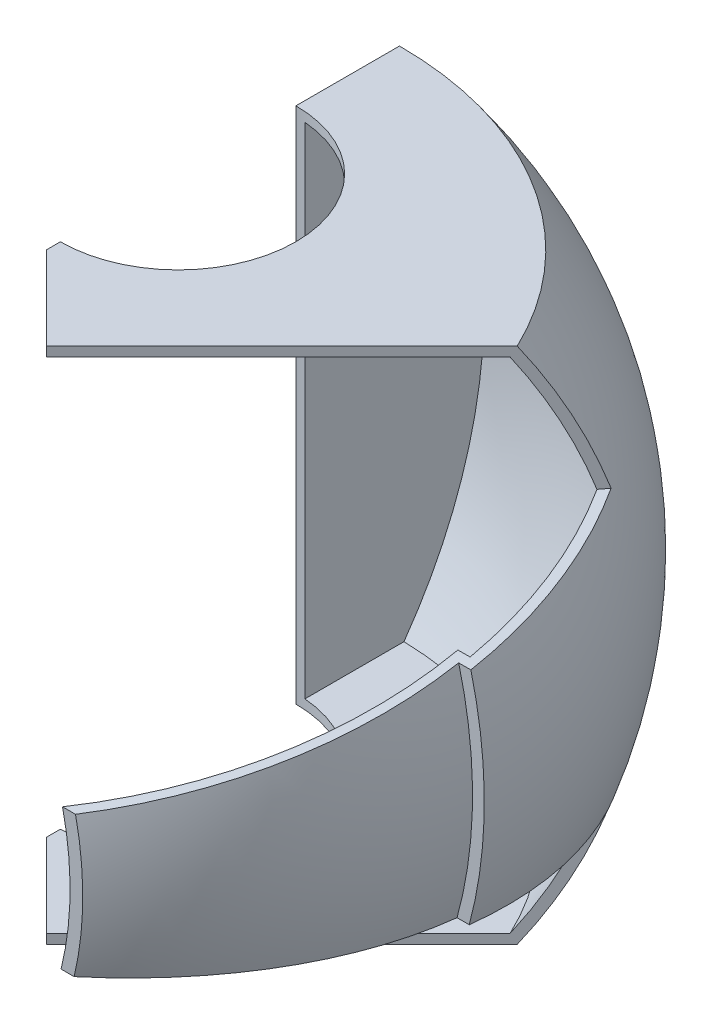
ISO-10303-21;
HEADER;
FILE_DESCRIPTION(('STEP AP214'),'2;1');
FILE_NAME('part.step','',(''),(''),'','','');
FILE_SCHEMA(('AUTOMOTIVE_DESIGN { 1 0 10303 214 1 1 1 1 }'));
ENDSEC;
DATA;
#1=APPLICATION_CONTEXT('core data for automotive mechanical design processes');
#2=APPLICATION_PROTOCOL_DEFINITION('international standard','automotive_design',2000,#1);
#3=PRODUCT_CONTEXT('',#1,'mechanical');
#4=PRODUCT('Part','Part','',(#3));
#5=PRODUCT_RELATED_PRODUCT_CATEGORY('part','',(#4));
#6=PRODUCT_DEFINITION_FORMATION('','',#4);
#7=PRODUCT_DEFINITION_CONTEXT('part definition',#1,'design');
#8=PRODUCT_DEFINITION('design','',#6,#7);
#9=PRODUCT_DEFINITION_SHAPE('','',#8);
#10=(LENGTH_UNIT() NAMED_UNIT(*) SI_UNIT(.MILLI.,.METRE.));
#11=(NAMED_UNIT(*) PLANE_ANGLE_UNIT() SI_UNIT($,.RADIAN.));
#12=(NAMED_UNIT(*) SI_UNIT($,.STERADIAN.) SOLID_ANGLE_UNIT());
#13=UNCERTAINTY_MEASURE_WITH_UNIT(LENGTH_MEASURE(1.E-05),#10,'distance_accuracy_value','');
#14=(GEOMETRIC_REPRESENTATION_CONTEXT(3) GLOBAL_UNCERTAINTY_ASSIGNED_CONTEXT((#13)) GLOBAL_UNIT_ASSIGNED_CONTEXT((#10,
#11,#12)) REPRESENTATION_CONTEXT('',''));
#15=CARTESIAN_POINT('',(0.,0.,0.));
#16=DIRECTION('',(0.,0.,1.));
#17=DIRECTION('',(1.,0.,0.));
#18=AXIS2_PLACEMENT_3D('',#15,#16,#17);
#19=CARTESIAN_POINT('',(0.,0.,0.));
#20=DIRECTION('',(-1.,0.,0.));
#21=DIRECTION('',(0.,0.,1.));
#22=AXIS2_PLACEMENT_3D('',#19,#20,#21);
#23=PLANE('',#22);
#24=DIRECTION('',(0.,-1.,0.));
#25=VECTOR('',#24,1.);
#26=CARTESIAN_POINT('',(0.,55.,0.));
#27=LINE('',#26,#25);
#28=CARTESIAN_POINT('',(0.,-53.,0.));
#29=VERTEX_POINT('',#28);
#30=CARTESIAN_POINT('',(0.,-55.,0.));
#31=VERTEX_POINT('',#30);
#32=EDGE_CURVE('E309',#29,#31,#27,.T.);
#33=ORIENTED_EDGE('',*,*,#32,.F.);
#34=DIRECTION('',(0.,0.,-1.));
#35=VECTOR('',#34,1.);
#36=CARTESIAN_POINT('',(0.,-53.,0.));
#37=LINE('',#36,#35);
#38=CARTESIAN_POINT('',(0.,-53.,-3.));
#39=VERTEX_POINT('',#38);
#40=EDGE_CURVE('E205',#29,#39,#37,.T.);
#41=ORIENTED_EDGE('',*,*,#40,.T.);
#42=DIRECTION('',(0.,-1.,0.));
#43=VECTOR('',#42,1.);
#44=CARTESIAN_POINT('',(0.,55.,-3.));
#45=LINE('',#44,#43);
#46=CARTESIAN_POINT('',(0.,-55.,-3.));
#47=VERTEX_POINT('',#46);
#48=EDGE_CURVE('E246',#47,#39,#45,.F.);
#49=ORIENTED_EDGE('',*,*,#48,.F.);
#50=DIRECTION('',(0.,0.,-1.));
#51=VECTOR('',#50,1.);
#52=CARTESIAN_POINT('',(0.,-55.,0.));
#53=LINE('',#52,#51);
#54=EDGE_CURVE('E317',#31,#47,#53,.T.);
#55=ORIENTED_EDGE('',*,*,#54,.F.);
#56=EDGE_LOOP('',(#33,#41,#49,#55));
#57=FACE_BOUND('',#56,.T.);
#58=ADVANCED_FACE('F33',(#57),#23,.T.);
#59=CARTESIAN_POINT('',(17.6776695296637,55.,17.6776695296636));
#60=DIRECTION('',(-0.70710678118655,0.,-0.707106781186545));
#61=DIRECTION('',(-0.707106781186545,0.,0.70710678118655));
#62=AXIS2_PLACEMENT_3D('',#59,#60,#61);
#63=PLANE('',#62);
#64=CARTESIAN_POINT('',(17.6776695296637,0.,17.6776695296636));
#65=DIRECTION('',(-0.70710678118655,0.,-0.707106781186545));
#66=DIRECTION('',(-0.707106781186545,0.,0.70710678118655));
#67=AXIS2_PLACEMENT_3D('',#64,#65,#66);
#68=CIRCLE('',#67,87.4985714169094);
#69=CARTESIAN_POINT('',(76.1371344084863,28.6527822761313,-40.7817953491593));
#70=VERTEX_POINT('',#69);
#71=CARTESIAN_POINT('',(66.906725990254,53.,-31.551386930927));
#72=VERTEX_POINT('',#71);
#73=EDGE_CURVE('E191',#70,#72,#68,.F.);
#74=ORIENTED_EDGE('',*,*,#73,.F.);
#75=DIRECTION('',(0.703571165799067,0.0998760697678762,-0.703571165799071));
#76=VECTOR('',#75,1.);
#77=CARTESIAN_POINT('',(20.112233053861,20.6997176418269,15.2431060054663));
#78=LINE('',#77,#76);
#79=CARTESIAN_POINT('',(77.6391324007676,28.8659997352322,-42.2837933414406));
#80=VERTEX_POINT('',#79);
#81=EDGE_CURVE('E290',#70,#80,#78,.T.);
#82=ORIENTED_EDGE('',*,*,#81,.T.);
#83=CARTESIAN_POINT('',(17.6776695296637,0.,17.6776695296636));
#84=DIRECTION('',(-0.70710678118655,0.,-0.707106781186545));
#85=DIRECTION('',(-0.707106781186545,0.,0.70710678118655));
#86=AXIS2_PLACEMENT_3D('',#83,#84,#85);
#87=CIRCLE('',#86,89.5767827062348);
#88=CARTESIAN_POINT('',(67.6726692796386,55.,-32.3173302203115));
#89=VERTEX_POINT('',#88);
#90=EDGE_CURVE('E275',#80,#89,#87,.F.);
#91=ORIENTED_EDGE('',*,*,#90,.T.);
#92=DIRECTION('',(0.707106781186545,0.,-0.70710678118655));
#93=VECTOR('',#92,1.);
#94=CARTESIAN_POINT('',(17.6776695296637,55.,17.6776695296636));
#95=LINE('',#94,#93);
#96=CARTESIAN_POINT('',(17.6776695296637,55.,17.6776695296637));
#97=VERTEX_POINT('',#96);
#98=EDGE_CURVE('E296',#97,#89,#95,.T.);
#99=ORIENTED_EDGE('',*,*,#98,.F.);
#100=DIRECTION('',(0.,-1.,0.));
#101=VECTOR('',#100,1.);
#102=CARTESIAN_POINT('',(17.6776695296637,55.,17.6776695296637));
#103=LINE('',#102,#101);
#104=CARTESIAN_POINT('',(17.6776695296637,53.,17.6776695296637));
#105=VERTEX_POINT('',#104);
#106=EDGE_CURVE('E310',#97,#105,#103,.T.);
#107=ORIENTED_EDGE('',*,*,#106,.T.);
#108=DIRECTION('',(0.707106781186545,0.,-0.70710678118655));
#109=VECTOR('',#108,1.);
#110=CARTESIAN_POINT('',(17.6776695296637,53.,17.6776695296636));
#111=LINE('',#110,#109);
#112=EDGE_CURVE('E177',#105,#72,#111,.T.);
#113=ORIENTED_EDGE('',*,*,#112,.T.);
#114=EDGE_LOOP('',(#74,#82,#91,#99,#107,#113));
#115=FACE_BOUND('',#114,.T.);
#116=ADVANCED_FACE('F352',(#115),#63,.F.);
#117=CARTESIAN_POINT('',(0.,55.,0.));
#118=DIRECTION('',(0.707106781186546,0.,-0.707106781186549));
#119=DIRECTION('',(-0.707106781186549,0.,-0.707106781186546));
#120=AXIS2_PLACEMENT_3D('',#117,#118,#119);
#121=PLANE('',#120);
#122=DIRECTION('',(0.707106781186549,0.,0.707106781186546));
#123=VECTOR('',#122,1.);
#124=CARTESIAN_POINT('',(0.,-53.,0.));
#125=LINE('',#124,#123);
#126=CARTESIAN_POINT('',(17.6776695296637,-53.,17.6776695296637));
#127=VERTEX_POINT('',#126);
#128=EDGE_CURVE('E186',#29,#127,#125,.T.);
#129=ORIENTED_EDGE('',*,*,#128,.F.);
#130=ORIENTED_EDGE('',*,*,#32,.T.);
#131=DIRECTION('',(0.707106781186549,0.,0.707106781186546));
#132=VECTOR('',#131,1.);
#133=CARTESIAN_POINT('',(0.,-55.,0.));
#134=LINE('',#133,#132);
#135=CARTESIAN_POINT('',(17.6776695296637,-55.,17.6776695296637));
#136=VERTEX_POINT('',#135);
#137=EDGE_CURVE('E292',#31,#136,#134,.T.);
#138=ORIENTED_EDGE('',*,*,#137,.T.);
#139=EDGE_CURVE('E300',#127,#136,#103,.T.);
#140=ORIENTED_EDGE('',*,*,#139,.F.);
#141=EDGE_LOOP('',(#129,#130,#138,#140));
#142=FACE_BOUND('',#141,.T.);
#143=ADVANCED_FACE('F378',(#142),#121,.F.);
#144=CARTESIAN_POINT('',(0.,55.,-28.));
#145=DIRECTION('',(0.,-1.,0.));
#146=DIRECTION('',(0.,0.,-1.));
#147=AXIS2_PLACEMENT_3D('',#144,#145,#146);
#148=CYLINDRICAL_SURFACE('',#147,25.);
#149=CARTESIAN_POINT('',(0.,-53.,-28.));
#150=DIRECTION('',(0.,-1.,0.));
#151=DIRECTION('',(0.,0.,-1.));
#152=AXIS2_PLACEMENT_3D('',#149,#150,#151);
#153=CIRCLE('',#152,25.);
#154=CARTESIAN_POINT('',(1.99999999999963,-53.,-52.9198715887543));
#155=VERTEX_POINT('',#154);
#156=EDGE_CURVE('E212',#155,#39,#153,.T.);
#157=ORIENTED_EDGE('',*,*,#156,.F.);
#158=DIRECTION('',(0.,-1.,0.));
#159=VECTOR('',#158,1.);
#160=CARTESIAN_POINT('',(1.99999999999963,53.,-52.9198715887543));
#161=LINE('',#160,#159);
#162=CARTESIAN_POINT('',(1.99999999999963,53.,-52.9198715887543));
#163=VERTEX_POINT('',#162);
#164=EDGE_CURVE('E210',#163,#155,#161,.T.);
#165=ORIENTED_EDGE('',*,*,#164,.F.);
#166=CARTESIAN_POINT('',(0.,53.,-28.));
#167=DIRECTION('',(0.,-1.,0.));
#168=DIRECTION('',(0.,0.,-1.));
#169=AXIS2_PLACEMENT_3D('',#166,#167,#168);
#170=CIRCLE('',#169,25.);
#171=CARTESIAN_POINT('',(0.,53.,-3.));
#172=VERTEX_POINT('',#171);
#173=EDGE_CURVE('E174',#163,#172,#170,.T.);
#174=ORIENTED_EDGE('',*,*,#173,.T.);
#175=CARTESIAN_POINT('',(0.,55.,-3.));
#176=VERTEX_POINT('',#175);
#177=EDGE_CURVE('E244',#172,#176,#45,.F.);
#178=ORIENTED_EDGE('',*,*,#177,.T.);
#179=CARTESIAN_POINT('',(0.,55.,-28.));
#180=DIRECTION('',(0.,-1.,0.));
#181=DIRECTION('',(0.,0.,-1.));
#182=AXIS2_PLACEMENT_3D('',#179,#180,#181);
#183=CIRCLE('',#182,25.);
#184=CARTESIAN_POINT('',(-3.70097021917372E-13,55.,-53.));
#185=VERTEX_POINT('',#184);
#186=EDGE_CURVE('E241',#185,#176,#183,.T.);
#187=ORIENTED_EDGE('',*,*,#186,.F.);
#188=DIRECTION('',(0.,-1.,0.));
#189=VECTOR('',#188,1.);
#190=CARTESIAN_POINT('',(-3.70097021917372E-13,55.,-53.));
#191=LINE('',#190,#189);
#192=CARTESIAN_POINT('',(-3.70097021917372E-13,-55.,-53.));
#193=VERTEX_POINT('',#192);
#194=EDGE_CURVE('E56',#185,#193,#191,.T.);
#195=ORIENTED_EDGE('',*,*,#194,.T.);
#196=CARTESIAN_POINT('',(0.,-55.,-28.));
#197=DIRECTION('',(0.,-1.,0.));
#198=DIRECTION('',(0.,0.,-1.));
#199=AXIS2_PLACEMENT_3D('',#196,#197,#198);
#200=CIRCLE('',#199,25.);
#201=EDGE_CURVE('E229',#193,#47,#200,.T.);
#202=ORIENTED_EDGE('',*,*,#201,.T.);
#203=ORIENTED_EDGE('',*,*,#48,.T.);
#204=EDGE_LOOP('',(#157,#165,#174,#178,#187,#195,#202,#203));
#205=FACE_BOUND('',#204,.T.);
#206=ADVANCED_FACE('F384',(#205),#148,.F.);
#207=ORIENTED_EDGE('',*,*,#194,.F.);
#208=DIRECTION('',(0.,0.,-1.));
#209=VECTOR('',#208,1.);
#210=CARTESIAN_POINT('',(0.,55.,0.));
#211=LINE('',#210,#209);
#212=CARTESIAN_POINT('',(-5.23675645672742E-13,55.,-74.9933330370107));
#213=VERTEX_POINT('',#212);
#214=EDGE_CURVE('E308',#185,#213,#211,.T.);
#215=ORIENTED_EDGE('',*,*,#214,.T.);
#216=CARTESIAN_POINT('',(0.,0.,0.));
#217=DIRECTION('',(-1.,0.,0.));
#218=DIRECTION('',(0.,0.,1.));
#219=AXIS2_PLACEMENT_3D('',#216,#217,#218);
#220=CIRCLE('',#219,93.);
#221=CARTESIAN_POINT('',(-5.23675645672742E-13,-55.,-74.9933330370107));
#222=VERTEX_POINT('',#221);
#223=EDGE_CURVE('E281',#222,#213,#220,.F.);
#224=ORIENTED_EDGE('',*,*,#223,.F.);
#225=EDGE_CURVE('E316',#193,#222,#53,.T.);
#226=ORIENTED_EDGE('',*,*,#225,.F.);
#227=EDGE_LOOP('',(#207,#215,#224,#226));
#228=FACE_BOUND('',#227,.T.);
#229=ADVANCED_FACE('F344',(#228),#23,.T.);
#230=CARTESIAN_POINT('',(-121.51311132399,-15.653786999192,60.));
#231=DIRECTION('',(0.,0.,-1.));
#232=DIRECTION('',(-1.,0.,0.));
#233=AXIS2_PLACEMENT_3D('',#230,#231,#232);
#234=PLANE('',#233);
#235=CARTESIAN_POINT('',(0.,0.,60.));
#236=DIRECTION('',(0.,0.,-1.));
#237=DIRECTION('',(-1.,0.,0.));
#238=AXIS2_PLACEMENT_3D('',#235,#236,#237);
#239=CIRCLE('',#238,65.0557453266043);
#240=CARTESIAN_POINT('',(63.1443501240128,-15.653786999192,60.));
#241=VERTEX_POINT('',#240);
#242=CARTESIAN_POINT('',(63.4542053179728,14.346213000808,60.));
#243=VERTEX_POINT('',#242);
#244=EDGE_CURVE('E204',#241,#243,#239,.F.);
#245=ORIENTED_EDGE('',*,*,#244,.F.);
#246=DIRECTION('',(1.,0.,0.));
#247=VECTOR('',#246,1.);
#248=CARTESIAN_POINT('',(-121.51311132399,-15.653786999192,60.));
#249=LINE('',#248,#247);
#250=CARTESIAN_POINT('',(65.9181989482717,-15.653786999192,60.));
#251=VERTEX_POINT('',#250);
#252=EDGE_CURVE('E285',#241,#251,#249,.T.);
#253=ORIENTED_EDGE('',*,*,#252,.T.);
#254=CARTESIAN_POINT('',(0.,0.,60.));
#255=DIRECTION('',(0.,0.,-1.));
#256=DIRECTION('',(-1.,0.,0.));
#257=AXIS2_PLACEMENT_3D('',#254,#255,#256);
#258=CIRCLE('',#257,67.7513837497066);
#259=CARTESIAN_POINT('',(66.2150751153803,14.346213000808,60.));
#260=VERTEX_POINT('',#259);
#261=EDGE_CURVE('E11',#251,#260,#258,.F.);
#262=ORIENTED_EDGE('',*,*,#261,.T.);
#263=DIRECTION('',(1.,0.,0.));
#264=VECTOR('',#263,1.);
#265=CARTESIAN_POINT('',(-121.51311132399,14.346213000808,60.));
#266=LINE('',#265,#264);
#267=EDGE_CURVE('E284',#243,#260,#266,.T.);
#268=ORIENTED_EDGE('',*,*,#267,.F.);
#269=EDGE_LOOP('',(#245,#253,#262,#268));
#270=FACE_BOUND('',#269,.T.);
#271=ADVANCED_FACE('F365',(#270),#234,.F.);
#272=DIRECTION('',(0.707106781186545,0.,-0.70710678118655));
#273=VECTOR('',#272,1.);
#274=CARTESIAN_POINT('',(17.6776695296637,-53.,17.6776695296636));
#275=LINE('',#274,#273);
#276=CARTESIAN_POINT('',(66.906725990254,-53.,-31.551386930927));
#277=VERTEX_POINT('',#276);
#278=EDGE_CURVE('E217',#127,#277,#275,.T.);
#279=ORIENTED_EDGE('',*,*,#278,.F.);
#280=ORIENTED_EDGE('',*,*,#139,.T.);
#281=DIRECTION('',(0.707106781186545,0.,-0.70710678118655));
#282=VECTOR('',#281,1.);
#283=CARTESIAN_POINT('',(17.6776695296637,-55.,17.6776695296636));
#284=LINE('',#283,#282);
#285=CARTESIAN_POINT('',(67.6726692796386,-55.,-32.3173302203115));
#286=VERTEX_POINT('',#285);
#287=EDGE_CURVE('E297',#136,#286,#284,.T.);
#288=ORIENTED_EDGE('',*,*,#287,.T.);
#289=CARTESIAN_POINT('',(17.6776695296637,0.,17.6776695296636));
#290=DIRECTION('',(-0.70710678118655,0.,-0.707106781186545));
#291=DIRECTION('',(-0.707106781186545,0.,0.70710678118655));
#292=AXIS2_PLACEMENT_3D('',#289,#290,#291);
#293=CIRCLE('',#292,89.5767827062348);
#294=CARTESIAN_POINT('',(77.3275751809574,-30.1293463517463,-41.9722361216304));
#295=VERTEX_POINT('',#294);
#296=EDGE_CURVE('E278',#286,#295,#293,.F.);
#297=ORIENTED_EDGE('',*,*,#296,.T.);
#298=DIRECTION('',(0.703571165799067,-0.0998760697678761,-0.703571165799071));
#299=VECTOR('',#298,1.);
#300=CARTESIAN_POINT('',(12.2906584172629,-20.8969730653837,23.0646806420645));
#301=LINE('',#300,#299);
#302=CARTESIAN_POINT('',(75.8200473590021,-29.9153439007624,-40.4647082996751));
#303=VERTEX_POINT('',#302);
#304=EDGE_CURVE('E287',#303,#295,#301,.T.);
#305=ORIENTED_EDGE('',*,*,#304,.F.);
#306=CARTESIAN_POINT('',(17.6776695296637,0.,17.6776695296636));
#307=DIRECTION('',(-0.70710678118655,0.,-0.707106781186545));
#308=DIRECTION('',(-0.707106781186545,0.,0.70710678118655));
#309=AXIS2_PLACEMENT_3D('',#306,#307,#308);
#310=CIRCLE('',#309,87.4985714169094);
#311=EDGE_CURVE('E187',#277,#303,#310,.F.);
#312=ORIENTED_EDGE('',*,*,#311,.F.);
#313=EDGE_LOOP('',(#279,#280,#288,#297,#305,#312));
#314=FACE_BOUND('',#313,.T.);
#315=ADVANCED_FACE('F336',(#314),#63,.F.);
#316=DIRECTION('',(0.,0.,-1.));
#317=VECTOR('',#316,1.);
#318=CARTESIAN_POINT('',(0.,53.,0.));
#319=LINE('',#318,#317);
#320=CARTESIAN_POINT('',(0.,53.,0.));
#321=VERTEX_POINT('',#320);
#322=EDGE_CURVE('E48',#321,#172,#319,.T.);
#323=ORIENTED_EDGE('',*,*,#322,.F.);
#324=CARTESIAN_POINT('',(0.,55.,0.));
#325=VERTEX_POINT('',#324);
#326=EDGE_CURVE('E305',#325,#321,#27,.T.);
#327=ORIENTED_EDGE('',*,*,#326,.F.);
#328=EDGE_CURVE('E313',#325,#176,#211,.T.);
#329=ORIENTED_EDGE('',*,*,#328,.T.);
#330=ORIENTED_EDGE('',*,*,#177,.F.);
#331=EDGE_LOOP('',(#323,#327,#329,#330));
#332=FACE_BOUND('',#331,.T.);
#333=ADVANCED_FACE('F387',(#332),#23,.T.);
#334=CARTESIAN_POINT('',(0.,55.,0.));
#335=DIRECTION('',(0.,-1.,0.));
#336=DIRECTION('',(0.,0.,-1.));
#337=AXIS2_PLACEMENT_3D('',#334,#335,#336);
#338=PLANE('',#337);
#339=ORIENTED_EDGE('',*,*,#214,.F.);
#340=ORIENTED_EDGE('',*,*,#186,.T.);
#341=ORIENTED_EDGE('',*,*,#328,.F.);
#342=DIRECTION('',(0.707106781186549,0.,0.707106781186546));
#343=VECTOR('',#342,1.);
#344=CARTESIAN_POINT('',(0.,55.,0.));
#345=LINE('',#344,#343);
#346=EDGE_CURVE('E293',#325,#97,#345,.T.);
#347=ORIENTED_EDGE('',*,*,#346,.T.);
#348=ORIENTED_EDGE('',*,*,#98,.T.);
#349=CARTESIAN_POINT('',(0.,55.,0.));
#350=DIRECTION('',(0.,-1.,0.));
#351=DIRECTION('',(0.,0.,-1.));
#352=AXIS2_PLACEMENT_3D('',#349,#350,#351);
#353=CIRCLE('',#352,74.9933330370107);
#354=EDGE_CURVE('E264',#213,#89,#353,.T.);
#355=ORIENTED_EDGE('',*,*,#354,.F.);
#356=EDGE_LOOP('',(#339,#340,#341,#347,#348,#355));
#357=FACE_BOUND('',#356,.T.);
#358=ADVANCED_FACE('F348',(#357),#338,.F.);
#359=CARTESIAN_POINT('',(0.,-55.,0.));
#360=DIRECTION('',(0.,-1.,0.));
#361=DIRECTION('',(0.,0.,-1.));
#362=AXIS2_PLACEMENT_3D('',#359,#360,#361);
#363=PLANE('',#362);
#364=ORIENTED_EDGE('',*,*,#201,.F.);
#365=ORIENTED_EDGE('',*,*,#225,.T.);
#366=CARTESIAN_POINT('',(0.,-55.,0.));
#367=DIRECTION('',(0.,-1.,0.));
#368=DIRECTION('',(0.,0.,-1.));
#369=AXIS2_PLACEMENT_3D('',#366,#367,#368);
#370=CIRCLE('',#369,74.9933330370107);
#371=EDGE_CURVE('E266',#222,#286,#370,.T.);
#372=ORIENTED_EDGE('',*,*,#371,.T.);
#373=ORIENTED_EDGE('',*,*,#287,.F.);
#374=ORIENTED_EDGE('',*,*,#137,.F.);
#375=ORIENTED_EDGE('',*,*,#54,.T.);
#376=EDGE_LOOP('',(#364,#365,#372,#373,#374,#375));
#377=FACE_BOUND('',#376,.T.);
#378=ADVANCED_FACE('F35',(#377),#363,.T.);
#379=CARTESIAN_POINT('',(-121.51311132399,29.3462130008089,-45.6666277669362));
#380=DIRECTION('',(0.,0.990074030670294,0.140546838428607));
#381=DIRECTION('',(0.,-0.140546838428607,0.990074030670295));
#382=AXIS2_PLACEMENT_3D('',#379,#380,#381);
#383=PLANE('',#382);
#384=DIRECTION('',(-1.,0.,0.));
#385=VECTOR('',#384,1.);
#386=CARTESIAN_POINT('',(-121.51311132399,23.1474780705262,-1.99999999999958));
#387=LINE('',#386,#385);
#388=CARTESIAN_POINT('',(87.9840568453996,23.1474780705263,-2.00000000000031));
#389=VERTEX_POINT('',#388);
#390=CARTESIAN_POINT('',(85.3958093759554,23.1474780705263,-2.0000000000003));
#391=VERTEX_POINT('',#390);
#392=EDGE_CURVE('E227',#389,#391,#387,.T.);
#393=ORIENTED_EDGE('',*,*,#392,.T.);
#394=CARTESIAN_POINT('',(0.,22.4119328083095,3.18150582855883));
#395=DIRECTION('',(0.,0.990074030670294,0.140546838428607));
#396=DIRECTION('',(0.,-0.140546838428607,0.990074030670295));
#397=AXIS2_PLACEMENT_3D('',#394,#395,#396);
#398=CIRCLE('',#397,85.5560242674861);
#399=EDGE_CURVE('E194',#391,#243,#398,.F.);
#400=ORIENTED_EDGE('',*,*,#399,.T.);
#401=ORIENTED_EDGE('',*,*,#267,.T.);
#402=CARTESIAN_POINT('',(0.,22.4119328083095,3.18150582855883));
#403=DIRECTION('',(0.,0.990074030670294,0.140546838428607));
#404=DIRECTION('',(0.,-0.140546838428607,0.990074030670295));
#405=AXIS2_PLACEMENT_3D('',#402,#403,#404);
#406=CIRCLE('',#405,87.6232462789337);
#407=CARTESIAN_POINT('',(87.5643040074895,22.8635662940838,-3.05729133390936E-13));
#408=VERTEX_POINT('',#407);
#409=EDGE_CURVE('E261',#408,#260,#406,.F.);
#410=ORIENTED_EDGE('',*,*,#409,.F.);
#411=DIRECTION('',(-1.,0.,0.));
#412=VECTOR('',#411,1.);
#413=CARTESIAN_POINT('',(-121.51311132399,22.8635662940836,4.23272528138341E-13));
#414=LINE('',#413,#412);
#415=CARTESIAN_POINT('',(90.1457560638106,22.8635662940838,-3.14797267981245E-13));
#416=VERTEX_POINT('',#415);
#417=EDGE_CURVE('E256',#416,#408,#414,.T.);
#418=ORIENTED_EDGE('',*,*,#417,.F.);
#419=CARTESIAN_POINT('',(0.,22.4119328083095,3.18150582855883));
#420=DIRECTION('',(0.,0.990074030670294,0.140546838428607));
#421=DIRECTION('',(0.,-0.140546838428607,0.990074030670295));
#422=AXIS2_PLACEMENT_3D('',#419,#420,#421);
#423=CIRCLE('',#422,90.2030115265486);
#424=EDGE_CURVE('E272',#80,#416,#423,.F.);
#425=ORIENTED_EDGE('',*,*,#424,.F.);
#426=ORIENTED_EDGE('',*,*,#81,.F.);
#427=CARTESIAN_POINT('',(0.,22.4119328083095,3.18150582855883));
#428=DIRECTION('',(0.,0.990074030670294,0.140546838428607));
#429=DIRECTION('',(0.,-0.140546838428607,0.990074030670295));
#430=AXIS2_PLACEMENT_3D('',#427,#428,#429);
#431=CIRCLE('',#430,88.1395670993378);
#432=EDGE_CURVE('E224',#70,#389,#431,.F.);
#433=ORIENTED_EDGE('',*,*,#432,.T.);
#434=EDGE_LOOP('',(#393,#400,#401,#410,#418,#425,#426,#433));
#435=FACE_BOUND('',#434,.T.);
#436=ADVANCED_FACE('F355',(#435),#383,.T.);
#437=CARTESIAN_POINT('',(-121.51311132399,-30.653786999193,-45.6666277669362));
#438=DIRECTION('',(0.,0.990074030670294,-0.140546838428607));
#439=DIRECTION('',(0.,0.140546838428607,0.990074030670295));
#440=AXIS2_PLACEMENT_3D('',#437,#438,#439);
#441=PLANE('',#440);
#442=CARTESIAN_POINT('',(0.,-23.6936777564395,3.36345707114373));
#443=DIRECTION('',(0.,0.990074030670294,-0.140546838428607));
#444=DIRECTION('',(0.,0.140546838428607,0.990074030670295));
#445=AXIS2_PLACEMENT_3D('',#442,#443,#444);
#446=CIRCLE('',#445,85.2029740731189);
#447=CARTESIAN_POINT('',(85.0305852520544,-24.4550520689103,-2.0000000000003));
#448=VERTEX_POINT('',#447);
#449=EDGE_CURVE('E199',#448,#241,#446,.F.);
#450=ORIENTED_EDGE('',*,*,#449,.F.);
#451=DIRECTION('',(-1.,0.,0.));
#452=VECTOR('',#451,1.);
#453=CARTESIAN_POINT('',(-121.51311132399,-24.4550520689102,-1.99999999999958));
#454=LINE('',#453,#452);
#455=CARTESIAN_POINT('',(87.6296207244268,-24.4550520689103,-2.00000000000031));
#456=VERTEX_POINT('',#455);
#457=EDGE_CURVE('E209',#456,#448,#454,.T.);
#458=ORIENTED_EDGE('',*,*,#457,.F.);
#459=CARTESIAN_POINT('',(0.,-23.6936777564395,3.36345707114373));
#460=DIRECTION('',(0.,0.990074030670294,-0.140546838428607));
#461=DIRECTION('',(0.,0.140546838428607,0.990074030670295));
#462=AXIS2_PLACEMENT_3D('',#459,#460,#461);
#463=CIRCLE('',#462,87.7969064996289);
#464=EDGE_CURVE('E196',#303,#456,#463,.F.);
#465=ORIENTED_EDGE('',*,*,#464,.F.);
#466=ORIENTED_EDGE('',*,*,#304,.T.);
#467=CARTESIAN_POINT('',(0.,-23.6936777564395,3.36345707114373));
#468=DIRECTION('',(0.,0.990074030670294,-0.140546838428607));
#469=DIRECTION('',(0.,0.140546838428607,0.990074030670295));
#470=AXIS2_PLACEMENT_3D('',#467,#468,#469);
#471=CIRCLE('',#470,89.8682190259971);
#472=CARTESIAN_POINT('',(89.8039864202132,-24.1711402924678,-3.13550105511352E-13));
#473=VERTEX_POINT('',#472);
#474=EDGE_CURVE('E269',#295,#473,#471,.F.);
#475=ORIENTED_EDGE('',*,*,#474,.T.);
#476=DIRECTION('',(-1.,0.,0.));
#477=VECTOR('',#476,1.);
#478=CARTESIAN_POINT('',(-121.51311132399,-24.1711402924677,4.23272528138341E-13));
#479=LINE('',#478,#477);
#480=CARTESIAN_POINT('',(87.2124187083573,-24.1711402924678,-3.04500532435603E-13));
#481=VERTEX_POINT('',#480);
#482=EDGE_CURVE('E253',#473,#481,#479,.T.);
#483=ORIENTED_EDGE('',*,*,#482,.T.);
#484=CARTESIAN_POINT('',(0.,-23.6936777564395,3.36345707114373));
#485=DIRECTION('',(0.,0.990074030670294,-0.140546838428607));
#486=DIRECTION('',(0.,0.140546838428607,0.990074030670295));
#487=AXIS2_PLACEMENT_3D('',#484,#485,#486);
#488=CIRCLE('',#487,87.2785585977712);
#489=EDGE_CURVE('E258',#481,#251,#488,.F.);
#490=ORIENTED_EDGE('',*,*,#489,.T.);
#491=ORIENTED_EDGE('',*,*,#252,.F.);
#492=EDGE_LOOP('',(#450,#458,#465,#466,#475,#483,#490,#491));
#493=FACE_BOUND('',#492,.T.);
#494=ADVANCED_FACE('F329',(#493),#441,.F.);
#495=ORIENTED_EDGE('',*,*,#326,.T.);
#496=DIRECTION('',(0.707106781186549,0.,0.707106781186546));
#497=VECTOR('',#496,1.);
#498=CARTESIAN_POINT('',(0.,53.,0.));
#499=LINE('',#498,#497);
#500=EDGE_CURVE('E220',#321,#105,#499,.T.);
#501=ORIENTED_EDGE('',*,*,#500,.T.);
#502=ORIENTED_EDGE('',*,*,#106,.F.);
#503=ORIENTED_EDGE('',*,*,#346,.F.);
#504=EDGE_LOOP('',(#495,#501,#502,#503));
#505=FACE_BOUND('',#504,.T.);
#506=ADVANCED_FACE('F390',(#505),#121,.F.);
#507=CARTESIAN_POINT('',(0.,0.,0.));
#508=DIRECTION('',(0.,-1.,0.));
#509=DIRECTION('',(0.,0.,1.));
#510=AXIS2_PLACEMENT_3D('',#507,#508,#509);
#511=SPHERICAL_SURFACE('',#510,93.);
#512=ORIENTED_EDGE('',*,*,#424,.T.);
#513=CARTESIAN_POINT('',(0.,0.,0.));
#514=DIRECTION('',(0.,0.,-1.));
#515=DIRECTION('',(-1.,0.,0.));
#516=AXIS2_PLACEMENT_3D('',#513,#514,#515);
#517=CIRCLE('',#516,93.);
#518=EDGE_CURVE('E41',#416,#473,#517,.T.);
#519=ORIENTED_EDGE('',*,*,#518,.T.);
#520=ORIENTED_EDGE('',*,*,#474,.F.);
#521=ORIENTED_EDGE('',*,*,#296,.F.);
#522=ORIENTED_EDGE('',*,*,#371,.F.);
#523=ORIENTED_EDGE('',*,*,#223,.T.);
#524=ORIENTED_EDGE('',*,*,#354,.T.);
#525=ORIENTED_EDGE('',*,*,#90,.F.);
#526=EDGE_LOOP('',(#512,#519,#520,#521,#522,#523,#524,#525));
#527=FACE_BOUND('',#526,.T.);
#528=ADVANCED_FACE('F322',(#527),#511,.T.);
#529=CARTESIAN_POINT('',(0.,0.,0.));
#530=DIRECTION('',(0.,-1.,0.));
#531=DIRECTION('',(1.,0.,0.));
#532=AXIS2_PLACEMENT_3D('',#529,#530,#531);
#533=SPHERICAL_SURFACE('',#532,90.5);
#534=ORIENTED_EDGE('',*,*,#409,.T.);
#535=ORIENTED_EDGE('',*,*,#261,.F.);
#536=ORIENTED_EDGE('',*,*,#489,.F.);
#537=CARTESIAN_POINT('',(0.,0.,0.));
#538=DIRECTION('',(0.,0.,-1.));
#539=DIRECTION('',(-1.,0.,0.));
#540=AXIS2_PLACEMENT_3D('',#537,#538,#539);
#541=CIRCLE('',#540,90.5);
#542=EDGE_CURVE('E250',#408,#481,#541,.T.);
#543=ORIENTED_EDGE('',*,*,#542,.F.);
#544=EDGE_LOOP('',(#534,#535,#536,#543));
#545=FACE_BOUND('',#544,.T.);
#546=ADVANCED_FACE('F360',(#545),#533,.T.);
#547=CARTESIAN_POINT('',(0.,0.,0.));
#548=DIRECTION('',(0.,0.,-1.));
#549=DIRECTION('',(-1.,0.,0.));
#550=AXIS2_PLACEMENT_3D('',#547,#548,#549);
#551=PLANE('',#550);
#552=ORIENTED_EDGE('',*,*,#417,.T.);
#553=ORIENTED_EDGE('',*,*,#542,.T.);
#554=ORIENTED_EDGE('',*,*,#482,.F.);
#555=ORIENTED_EDGE('',*,*,#518,.F.);
#556=EDGE_LOOP('',(#552,#553,#554,#555));
#557=FACE_BOUND('',#556,.T.);
#558=ADVANCED_FACE('F358',(#557),#551,.F.);
#559=CARTESIAN_POINT('',(2.,0.,0.));
#560=DIRECTION('',(-1.,0.,0.));
#561=DIRECTION('',(0.,0.,1.));
#562=AXIS2_PLACEMENT_3D('',#559,#560,#561);
#563=PLANE('',#562);
#564=ORIENTED_EDGE('',*,*,#164,.T.);
#565=DIRECTION('',(0.,0.,-1.));
#566=VECTOR('',#565,1.);
#567=CARTESIAN_POINT('',(2.,-53.,0.));
#568=LINE('',#567,#566);
#569=CARTESIAN_POINT('',(1.99999999999948,-53.,-73.9459261893446));
#570=VERTEX_POINT('',#569);
#571=EDGE_CURVE('E183',#155,#570,#568,.T.);
#572=ORIENTED_EDGE('',*,*,#571,.T.);
#573=CARTESIAN_POINT('',(2.,0.,0.));
#574=DIRECTION('',(-1.,0.,0.));
#575=DIRECTION('',(0.,0.,1.));
#576=AXIS2_PLACEMENT_3D('',#573,#574,#575);
#577=CIRCLE('',#576,90.9780193233508);
#578=CARTESIAN_POINT('',(1.99999999999948,53.,-73.9459261893446));
#579=VERTEX_POINT('',#578);
#580=EDGE_CURVE('E180',#570,#579,#577,.F.);
#581=ORIENTED_EDGE('',*,*,#580,.T.);
#582=DIRECTION('',(0.,0.,-1.));
#583=VECTOR('',#582,1.);
#584=CARTESIAN_POINT('',(2.,53.,0.));
#585=LINE('',#584,#583);
#586=EDGE_CURVE('E168',#163,#579,#585,.T.);
#587=ORIENTED_EDGE('',*,*,#586,.F.);
#588=EDGE_LOOP('',(#564,#572,#581,#587));
#589=FACE_BOUND('',#588,.T.);
#590=ADVANCED_FACE('F181',(#589),#563,.F.);
#591=CARTESIAN_POINT('',(0.,53.,0.));
#592=DIRECTION('',(0.,-1.,0.));
#593=DIRECTION('',(0.,0.,-1.));
#594=AXIS2_PLACEMENT_3D('',#591,#592,#593);
#595=PLANE('',#594);
#596=ORIENTED_EDGE('',*,*,#586,.T.);
#597=CARTESIAN_POINT('',(0.,53.,0.));
#598=DIRECTION('',(0.,-1.,0.));
#599=DIRECTION('',(0.,0.,-1.));
#600=AXIS2_PLACEMENT_3D('',#597,#598,#599);
#601=CIRCLE('',#600,73.9729680356277);
#602=EDGE_CURVE('E172',#579,#72,#601,.T.);
#603=ORIENTED_EDGE('',*,*,#602,.T.);
#604=ORIENTED_EDGE('',*,*,#112,.F.);
#605=ORIENTED_EDGE('',*,*,#500,.F.);
#606=ORIENTED_EDGE('',*,*,#322,.T.);
#607=ORIENTED_EDGE('',*,*,#173,.F.);
#608=EDGE_LOOP('',(#596,#603,#604,#605,#606,#607));
#609=FACE_BOUND('',#608,.T.);
#610=ADVANCED_FACE('F170',(#609),#595,.T.);
#611=CARTESIAN_POINT('',(0.,-53.,0.));
#612=DIRECTION('',(0.,-1.,0.));
#613=DIRECTION('',(0.,0.,-1.));
#614=AXIS2_PLACEMENT_3D('',#611,#612,#613);
#615=PLANE('',#614);
#616=ORIENTED_EDGE('',*,*,#156,.T.);
#617=ORIENTED_EDGE('',*,*,#40,.F.);
#618=ORIENTED_EDGE('',*,*,#128,.T.);
#619=ORIENTED_EDGE('',*,*,#278,.T.);
#620=CARTESIAN_POINT('',(0.,-53.,0.));
#621=DIRECTION('',(0.,-1.,0.));
#622=DIRECTION('',(0.,0.,-1.));
#623=AXIS2_PLACEMENT_3D('',#620,#621,#622);
#624=CIRCLE('',#623,73.9729680356277);
#625=EDGE_CURVE('E193',#570,#277,#624,.T.);
#626=ORIENTED_EDGE('',*,*,#625,.F.);
#627=ORIENTED_EDGE('',*,*,#571,.F.);
#628=EDGE_LOOP('',(#616,#617,#618,#619,#626,#627));
#629=FACE_BOUND('',#628,.T.);
#630=ADVANCED_FACE('F374',(#629),#615,.F.);
#631=CARTESIAN_POINT('',(0.,0.,0.));
#632=DIRECTION('',(0.,-1.,0.));
#633=DIRECTION('',(0.,0.,1.));
#634=AXIS2_PLACEMENT_3D('',#631,#632,#633);
#635=SPHERICAL_SURFACE('',#634,91.);
#636=ORIENTED_EDGE('',*,*,#432,.F.);
#637=ORIENTED_EDGE('',*,*,#73,.T.);
#638=ORIENTED_EDGE('',*,*,#602,.F.);
#639=ORIENTED_EDGE('',*,*,#580,.F.);
#640=ORIENTED_EDGE('',*,*,#625,.T.);
#641=ORIENTED_EDGE('',*,*,#311,.T.);
#642=ORIENTED_EDGE('',*,*,#464,.T.);
#643=CARTESIAN_POINT('',(0.,0.,-2.));
#644=DIRECTION('',(0.,0.,-1.));
#645=DIRECTION('',(-1.,0.,0.));
#646=AXIS2_PLACEMENT_3D('',#643,#644,#645);
#647=CIRCLE('',#646,90.9780193233508);
#648=EDGE_CURVE('E203',#389,#456,#647,.T.);
#649=ORIENTED_EDGE('',*,*,#648,.F.);
#650=EDGE_LOOP('',(#636,#637,#638,#639,#640,#641,#642,#649));
#651=FACE_BOUND('',#650,.T.);
#652=ADVANCED_FACE('F189',(#651),#635,.F.);
#653=CARTESIAN_POINT('',(0.,0.,0.));
#654=DIRECTION('',(0.,-1.,0.));
#655=DIRECTION('',(1.,0.,0.));
#656=AXIS2_PLACEMENT_3D('',#653,#654,#655);
#657=SPHERICAL_SURFACE('',#656,88.5);
#658=ORIENTED_EDGE('',*,*,#399,.F.);
#659=CARTESIAN_POINT('',(0.,0.,-2.));
#660=DIRECTION('',(0.,0.,-1.));
#661=DIRECTION('',(-1.,0.,0.));
#662=AXIS2_PLACEMENT_3D('',#659,#660,#661);
#663=CIRCLE('',#662,88.4773982438453);
#664=EDGE_CURVE('E207',#391,#448,#663,.T.);
#665=ORIENTED_EDGE('',*,*,#664,.T.);
#666=ORIENTED_EDGE('',*,*,#449,.T.);
#667=ORIENTED_EDGE('',*,*,#244,.T.);
#668=EDGE_LOOP('',(#658,#665,#666,#667));
#669=FACE_BOUND('',#668,.T.);
#670=ADVANCED_FACE('F369',(#669),#657,.F.);
#671=CARTESIAN_POINT('',(0.,0.,-2.));
#672=DIRECTION('',(0.,0.,-1.));
#673=DIRECTION('',(-1.,0.,0.));
#674=AXIS2_PLACEMENT_3D('',#671,#672,#673);
#675=PLANE('',#674);
#676=ORIENTED_EDGE('',*,*,#392,.F.);
#677=ORIENTED_EDGE('',*,*,#648,.T.);
#678=ORIENTED_EDGE('',*,*,#457,.T.);
#679=ORIENTED_EDGE('',*,*,#664,.F.);
#680=EDGE_LOOP('',(#676,#677,#678,#679));
#681=FACE_BOUND('',#680,.T.);
#682=ADVANCED_FACE('F372',(#681),#675,.T.);
#683=CLOSED_SHELL('',(#58,#116,#143,#206,#229,#271,#315,#333,#358,#378,#436,#494,#506,#528,#546,
#558,#590,#610,#630,#652,#670,#682));
#684=MANIFOLD_SOLID_BREP('B2',#683);
#685=ADVANCED_BREP_SHAPE_REPRESENTATION('',(#18,#684),#14);
#686=SHAPE_DEFINITION_REPRESENTATION(#9,#685);
ENDSEC;
END-ISO-10303-21;
